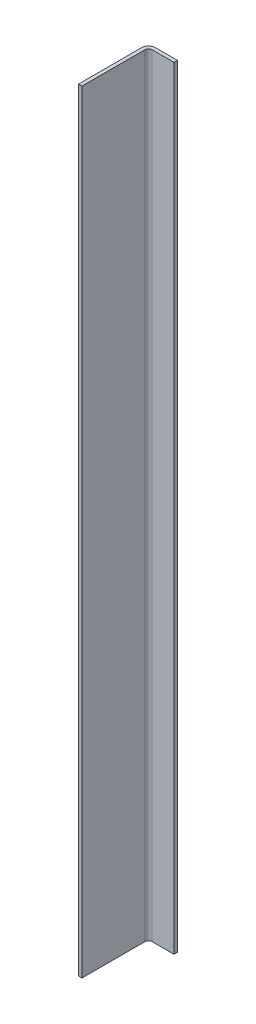
ISO-10303-21;
HEADER;
FILE_DESCRIPTION(('STEP AP214'),'2;1');
FILE_NAME('part.step','',(''),(''),'','','');
FILE_SCHEMA(('AUTOMOTIVE_DESIGN { 1 0 10303 214 1 1 1 1 }'));
ENDSEC;
DATA;
#1=APPLICATION_CONTEXT('core data for automotive mechanical design processes');
#2=APPLICATION_PROTOCOL_DEFINITION('international standard','automotive_design',2000,#1);
#3=PRODUCT_CONTEXT('',#1,'mechanical');
#4=PRODUCT('Part','Part','',(#3));
#5=PRODUCT_RELATED_PRODUCT_CATEGORY('part','',(#4));
#6=PRODUCT_DEFINITION_FORMATION('','',#4);
#7=PRODUCT_DEFINITION_CONTEXT('part definition',#1,'design');
#8=PRODUCT_DEFINITION('design','',#6,#7);
#9=PRODUCT_DEFINITION_SHAPE('','',#8);
#10=(LENGTH_UNIT() NAMED_UNIT(*) SI_UNIT(.MILLI.,.METRE.));
#11=(NAMED_UNIT(*) PLANE_ANGLE_UNIT() SI_UNIT($,.RADIAN.));
#12=(NAMED_UNIT(*) SI_UNIT($,.STERADIAN.) SOLID_ANGLE_UNIT());
#13=UNCERTAINTY_MEASURE_WITH_UNIT(LENGTH_MEASURE(1.E-05),#10,'distance_accuracy_value','');
#14=(GEOMETRIC_REPRESENTATION_CONTEXT(3) GLOBAL_UNCERTAINTY_ASSIGNED_CONTEXT((#13)) GLOBAL_UNIT_ASSIGNED_CONTEXT((#10,
#11,#12)) REPRESENTATION_CONTEXT('',''));
#15=CARTESIAN_POINT('',(0.,0.,0.));
#16=DIRECTION('',(0.,0.,1.));
#17=DIRECTION('',(1.,0.,0.));
#18=AXIS2_PLACEMENT_3D('',#15,#16,#17);
#19=CARTESIAN_POINT('',(38.1,-508.,4.55422));
#20=DIRECTION('',(1.,0.,0.));
#21=DIRECTION('',(0.,0.,-1.));
#22=AXIS2_PLACEMENT_3D('',#19,#20,#21);
#23=PLANE('',#22);
#24=DIRECTION('',(0.,1.,0.));
#25=VECTOR('',#24,1.);
#26=CARTESIAN_POINT('',(38.1,-508.,4.55422));
#27=LINE('',#26,#25);
#28=CARTESIAN_POINT('',(38.1,-508.,4.55422));
#29=VERTEX_POINT('',#28);
#30=CARTESIAN_POINT('',(38.1,508.,4.55422));
#31=VERTEX_POINT('',#30);
#32=EDGE_CURVE('E109',#29,#31,#27,.T.);
#33=ORIENTED_EDGE('',*,*,#32,.F.);
#34=DIRECTION('',(0.,0.,1.));
#35=VECTOR('',#34,1.);
#36=CARTESIAN_POINT('',(38.1,-508.,4.55422));
#37=LINE('',#36,#35);
#38=CARTESIAN_POINT('',(38.1,-508.,0.));
#39=VERTEX_POINT('',#38);
#40=EDGE_CURVE('E112',#39,#29,#37,.T.);
#41=ORIENTED_EDGE('',*,*,#40,.F.);
#42=DIRECTION('',(0.,1.,0.));
#43=VECTOR('',#42,1.);
#44=CARTESIAN_POINT('',(38.1,-508.,0.));
#45=LINE('',#44,#43);
#46=CARTESIAN_POINT('',(38.1,508.,0.));
#47=VERTEX_POINT('',#46);
#48=EDGE_CURVE('E139',#47,#39,#45,.F.);
#49=ORIENTED_EDGE('',*,*,#48,.F.);
#50=DIRECTION('',(0.,0.,-1.));
#51=VECTOR('',#50,1.);
#52=CARTESIAN_POINT('',(38.1,508.,4.55422));
#53=LINE('',#52,#51);
#54=EDGE_CURVE('E114',#31,#47,#53,.T.);
#55=ORIENTED_EDGE('',*,*,#54,.F.);
#56=EDGE_LOOP('',(#33,#41,#49,#55));
#57=FACE_BOUND('',#56,.T.);
#58=ADVANCED_FACE('F33',(#57),#23,.T.);
#59=CARTESIAN_POINT('',(38.1,-508.,0.));
#60=DIRECTION('',(0.,0.,-1.));
#61=DIRECTION('',(-1.,0.,0.));
#62=AXIS2_PLACEMENT_3D('',#59,#60,#61);
#63=PLANE('',#62);
#64=DIRECTION('',(0.,-1.,0.));
#65=VECTOR('',#64,1.);
#66=CARTESIAN_POINT('',(9.1186,1832.4576,0.));
#67=LINE('',#66,#65);
#68=CARTESIAN_POINT('',(9.1186,508.,0.));
#69=VERTEX_POINT('',#68);
#70=CARTESIAN_POINT('',(9.1186,-508.,0.));
#71=VERTEX_POINT('',#70);
#72=EDGE_CURVE('E119',#69,#71,#67,.T.);
#73=ORIENTED_EDGE('',*,*,#72,.F.);
#74=DIRECTION('',(1.,0.,0.));
#75=VECTOR('',#74,1.);
#76=CARTESIAN_POINT('',(0.,508.,0.));
#77=LINE('',#76,#75);
#78=EDGE_CURVE('E150',#47,#69,#77,.F.);
#79=ORIENTED_EDGE('',*,*,#78,.F.);
#80=ORIENTED_EDGE('',*,*,#48,.T.);
#81=DIRECTION('',(1.,0.,0.));
#82=VECTOR('',#81,1.);
#83=CARTESIAN_POINT('',(0.,-508.,0.));
#84=LINE('',#83,#82);
#85=EDGE_CURVE('E74',#39,#71,#84,.F.);
#86=ORIENTED_EDGE('',*,*,#85,.T.);
#87=EDGE_LOOP('',(#73,#79,#80,#86));
#88=FACE_BOUND('',#87,.T.);
#89=ADVANCED_FACE('F179',(#88),#63,.T.);
#90=CARTESIAN_POINT('',(9.1186,1832.4576,9.1186));
#91=DIRECTION('',(0.,-1.,0.));
#92=DIRECTION('',(0.,0.,-1.));
#93=AXIS2_PLACEMENT_3D('',#90,#91,#92);
#94=CYLINDRICAL_SURFACE('',#93,9.1186);
#95=CARTESIAN_POINT('',(9.1186,508.,9.1186));
#96=DIRECTION('',(0.,-1.,0.));
#97=DIRECTION('',(0.,0.,-1.));
#98=AXIS2_PLACEMENT_3D('',#95,#96,#97);
#99=CIRCLE('',#98,9.1186);
#100=CARTESIAN_POINT('',(0.,508.,9.1186));
#101=VERTEX_POINT('',#100);
#102=EDGE_CURVE('E149',#69,#101,#99,.F.);
#103=ORIENTED_EDGE('',*,*,#102,.F.);
#104=ORIENTED_EDGE('',*,*,#72,.T.);
#105=CARTESIAN_POINT('',(9.1186,-508.,9.1186));
#106=DIRECTION('',(0.,-1.,0.));
#107=DIRECTION('',(0.,0.,-1.));
#108=AXIS2_PLACEMENT_3D('',#105,#106,#107);
#109=CIRCLE('',#108,9.1186);
#110=CARTESIAN_POINT('',(0.,-508.,9.1186));
#111=VERTEX_POINT('',#110);
#112=EDGE_CURVE('E36',#71,#111,#109,.F.);
#113=ORIENTED_EDGE('',*,*,#112,.T.);
#114=DIRECTION('',(0.,1.,0.));
#115=VECTOR('',#114,1.);
#116=CARTESIAN_POINT('',(0.,-508.,9.1186));
#117=LINE('',#116,#115);
#118=EDGE_CURVE('E118',#101,#111,#117,.F.);
#119=ORIENTED_EDGE('',*,*,#118,.F.);
#120=EDGE_LOOP('',(#103,#104,#113,#119));
#121=FACE_BOUND('',#120,.T.);
#122=ADVANCED_FACE('F177',(#121),#94,.T.);
#123=CARTESIAN_POINT('',(4.55422,-508.,4.55422));
#124=DIRECTION('',(0.,0.,1.));
#125=DIRECTION('',(1.,0.,0.));
#126=AXIS2_PLACEMENT_3D('',#123,#124,#125);
#127=PLANE('',#126);
#128=DIRECTION('',(1.,0.,0.));
#129=VECTOR('',#128,1.);
#130=CARTESIAN_POINT('',(0.,-508.,4.55422));
#131=LINE('',#130,#129);
#132=CARTESIAN_POINT('',(9.10844,-508.,4.55422));
#133=VERTEX_POINT('',#132);
#134=EDGE_CURVE('E122',#133,#29,#131,.T.);
#135=ORIENTED_EDGE('',*,*,#134,.T.);
#136=ORIENTED_EDGE('',*,*,#32,.T.);
#137=DIRECTION('',(1.,0.,0.));
#138=VECTOR('',#137,1.);
#139=CARTESIAN_POINT('',(0.,508.,4.55422));
#140=LINE('',#139,#138);
#141=CARTESIAN_POINT('',(9.10844,508.,4.55422));
#142=VERTEX_POINT('',#141);
#143=EDGE_CURVE('E145',#142,#31,#140,.T.);
#144=ORIENTED_EDGE('',*,*,#143,.F.);
#145=DIRECTION('',(0.,1.,0.));
#146=VECTOR('',#145,1.);
#147=CARTESIAN_POINT('',(9.10844,-1832.4576,4.55422));
#148=LINE('',#147,#146);
#149=EDGE_CURVE('E124',#142,#133,#148,.F.);
#150=ORIENTED_EDGE('',*,*,#149,.T.);
#151=EDGE_LOOP('',(#135,#136,#144,#150));
#152=FACE_BOUND('',#151,.T.);
#153=ADVANCED_FACE('F123',(#152),#127,.T.);
#154=CARTESIAN_POINT('',(0.,-508.,0.));
#155=DIRECTION('',(-1.,0.,0.));
#156=DIRECTION('',(0.,0.,1.));
#157=AXIS2_PLACEMENT_3D('',#154,#155,#156);
#158=PLANE('',#157);
#159=DIRECTION('',(0.,0.,1.));
#160=VECTOR('',#159,1.);
#161=CARTESIAN_POINT('',(0.,-508.,0.));
#162=LINE('',#161,#160);
#163=CARTESIAN_POINT('',(0.,-508.,92.075));
#164=VERTEX_POINT('',#163);
#165=EDGE_CURVE('E155',#111,#164,#162,.T.);
#166=ORIENTED_EDGE('',*,*,#165,.T.);
#167=DIRECTION('',(0.,1.,0.));
#168=VECTOR('',#167,1.);
#169=CARTESIAN_POINT('',(0.,-508.,92.075));
#170=LINE('',#169,#168);
#171=CARTESIAN_POINT('',(0.,508.,92.075));
#172=VERTEX_POINT('',#171);
#173=EDGE_CURVE('E90',#172,#164,#170,.F.);
#174=ORIENTED_EDGE('',*,*,#173,.F.);
#175=DIRECTION('',(0.,0.,1.));
#176=VECTOR('',#175,1.);
#177=CARTESIAN_POINT('',(0.,508.,0.));
#178=LINE('',#177,#176);
#179=EDGE_CURVE('E147',#101,#172,#178,.T.);
#180=ORIENTED_EDGE('',*,*,#179,.F.);
#181=ORIENTED_EDGE('',*,*,#118,.T.);
#182=EDGE_LOOP('',(#166,#174,#180,#181));
#183=FACE_BOUND('',#182,.T.);
#184=ADVANCED_FACE('F174',(#183),#158,.T.);
#185=CARTESIAN_POINT('',(0.,-508.,92.075));
#186=DIRECTION('',(0.,0.,1.));
#187=DIRECTION('',(1.,0.,0.));
#188=AXIS2_PLACEMENT_3D('',#185,#186,#187);
#189=PLANE('',#188);
#190=ORIENTED_EDGE('',*,*,#173,.T.);
#191=DIRECTION('',(-1.,0.,0.));
#192=VECTOR('',#191,1.);
#193=CARTESIAN_POINT('',(0.,-508.,92.075));
#194=LINE('',#193,#192);
#195=CARTESIAN_POINT('',(4.55422,-508.,92.075));
#196=VERTEX_POINT('',#195);
#197=EDGE_CURVE('E131',#196,#164,#194,.T.);
#198=ORIENTED_EDGE('',*,*,#197,.F.);
#199=DIRECTION('',(0.,1.,0.));
#200=VECTOR('',#199,1.);
#201=CARTESIAN_POINT('',(4.55422,-508.,92.075));
#202=LINE('',#201,#200);
#203=CARTESIAN_POINT('',(4.55422,508.,92.075));
#204=VERTEX_POINT('',#203);
#205=EDGE_CURVE('E83',#204,#196,#202,.F.);
#206=ORIENTED_EDGE('',*,*,#205,.F.);
#207=DIRECTION('',(1.,0.,0.));
#208=VECTOR('',#207,1.);
#209=CARTESIAN_POINT('',(0.,508.,92.075));
#210=LINE('',#209,#208);
#211=EDGE_CURVE('E136',#172,#204,#210,.T.);
#212=ORIENTED_EDGE('',*,*,#211,.F.);
#213=EDGE_LOOP('',(#190,#198,#206,#212));
#214=FACE_BOUND('',#213,.T.);
#215=ADVANCED_FACE('F173',(#214),#189,.T.);
#216=CARTESIAN_POINT('',(0.,-508.,0.));
#217=DIRECTION('',(0.,1.,0.));
#218=DIRECTION('',(0.,0.,1.));
#219=AXIS2_PLACEMENT_3D('',#216,#217,#218);
#220=PLANE('',#219);
#221=ORIENTED_EDGE('',*,*,#165,.F.);
#222=ORIENTED_EDGE('',*,*,#112,.F.);
#223=ORIENTED_EDGE('',*,*,#85,.F.);
#224=ORIENTED_EDGE('',*,*,#40,.T.);
#225=ORIENTED_EDGE('',*,*,#134,.F.);
#226=CARTESIAN_POINT('',(9.10844,-508.,9.10844));
#227=DIRECTION('',(0.,1.,0.));
#228=DIRECTION('',(0.,0.,1.));
#229=AXIS2_PLACEMENT_3D('',#226,#227,#228);
#230=CIRCLE('',#229,4.55422);
#231=CARTESIAN_POINT('',(4.55422,-508.,9.10844));
#232=VERTEX_POINT('',#231);
#233=EDGE_CURVE('E157',#133,#232,#230,.T.);
#234=ORIENTED_EDGE('',*,*,#233,.T.);
#235=DIRECTION('',(0.,0.,-1.));
#236=VECTOR('',#235,1.);
#237=CARTESIAN_POINT('',(4.55422,-508.,92.075));
#238=LINE('',#237,#236);
#239=EDGE_CURVE('E141',#196,#232,#238,.T.);
#240=ORIENTED_EDGE('',*,*,#239,.F.);
#241=ORIENTED_EDGE('',*,*,#197,.T.);
#242=EDGE_LOOP('',(#221,#222,#223,#224,#225,#234,#240,#241));
#243=FACE_BOUND('',#242,.T.);
#244=ADVANCED_FACE('F129',(#243),#220,.F.);
#245=CARTESIAN_POINT('',(9.10844,-1832.4576,9.10844));
#246=DIRECTION('',(0.,1.,0.));
#247=DIRECTION('',(0.,0.,1.));
#248=AXIS2_PLACEMENT_3D('',#245,#246,#247);
#249=CYLINDRICAL_SURFACE('',#248,4.55422);
#250=CARTESIAN_POINT('',(9.10844,508.,9.10844));
#251=DIRECTION('',(0.,1.,0.));
#252=DIRECTION('',(0.,0.,1.));
#253=AXIS2_PLACEMENT_3D('',#250,#251,#252);
#254=CIRCLE('',#253,4.55422);
#255=CARTESIAN_POINT('',(4.55422,508.,9.10844));
#256=VERTEX_POINT('',#255);
#257=EDGE_CURVE('E51',#256,#142,#254,.F.);
#258=ORIENTED_EDGE('',*,*,#257,.F.);
#259=DIRECTION('',(0.,1.,0.));
#260=VECTOR('',#259,1.);
#261=CARTESIAN_POINT('',(4.55422,-508.,9.10843999999999));
#262=LINE('',#261,#260);
#263=EDGE_CURVE('E42',#232,#256,#262,.T.);
#264=ORIENTED_EDGE('',*,*,#263,.F.);
#265=ORIENTED_EDGE('',*,*,#233,.F.);
#266=ORIENTED_EDGE('',*,*,#149,.F.);
#267=EDGE_LOOP('',(#258,#264,#265,#266));
#268=FACE_BOUND('',#267,.T.);
#269=ADVANCED_FACE('F168',(#268),#249,.F.);
#270=CARTESIAN_POINT('',(0.,508.,0.));
#271=DIRECTION('',(0.,1.,0.));
#272=DIRECTION('',(0.,0.,1.));
#273=AXIS2_PLACEMENT_3D('',#270,#271,#272);
#274=PLANE('',#273);
#275=ORIENTED_EDGE('',*,*,#257,.T.);
#276=ORIENTED_EDGE('',*,*,#143,.T.);
#277=ORIENTED_EDGE('',*,*,#54,.T.);
#278=ORIENTED_EDGE('',*,*,#78,.T.);
#279=ORIENTED_EDGE('',*,*,#102,.T.);
#280=ORIENTED_EDGE('',*,*,#179,.T.);
#281=ORIENTED_EDGE('',*,*,#211,.T.);
#282=DIRECTION('',(0.,0.,-1.));
#283=VECTOR('',#282,1.);
#284=CARTESIAN_POINT('',(4.55422,508.,92.075));
#285=LINE('',#284,#283);
#286=EDGE_CURVE('E11',#256,#204,#285,.F.);
#287=ORIENTED_EDGE('',*,*,#286,.F.);
#288=EDGE_LOOP('',(#275,#276,#277,#278,#279,#280,#281,#287));
#289=FACE_BOUND('',#288,.T.);
#290=ADVANCED_FACE('F172',(#289),#274,.T.);
#291=CARTESIAN_POINT('',(4.55422,-508.,92.075));
#292=DIRECTION('',(1.,0.,0.));
#293=DIRECTION('',(0.,0.,-1.));
#294=AXIS2_PLACEMENT_3D('',#291,#292,#293);
#295=PLANE('',#294);
#296=ORIENTED_EDGE('',*,*,#263,.T.);
#297=ORIENTED_EDGE('',*,*,#286,.T.);
#298=ORIENTED_EDGE('',*,*,#205,.T.);
#299=ORIENTED_EDGE('',*,*,#239,.T.);
#300=EDGE_LOOP('',(#296,#297,#298,#299));
#301=FACE_BOUND('',#300,.T.);
#302=ADVANCED_FACE('F170',(#301),#295,.T.);
#303=CLOSED_SHELL('',(#58,#89,#122,#153,#184,#215,#244,#269,#290,#302));
#304=MANIFOLD_SOLID_BREP('B2',#303);
#305=ADVANCED_BREP_SHAPE_REPRESENTATION('',(#18,#304),#14);
#306=SHAPE_DEFINITION_REPRESENTATION(#9,#305);
ENDSEC;
END-ISO-10303-21;
